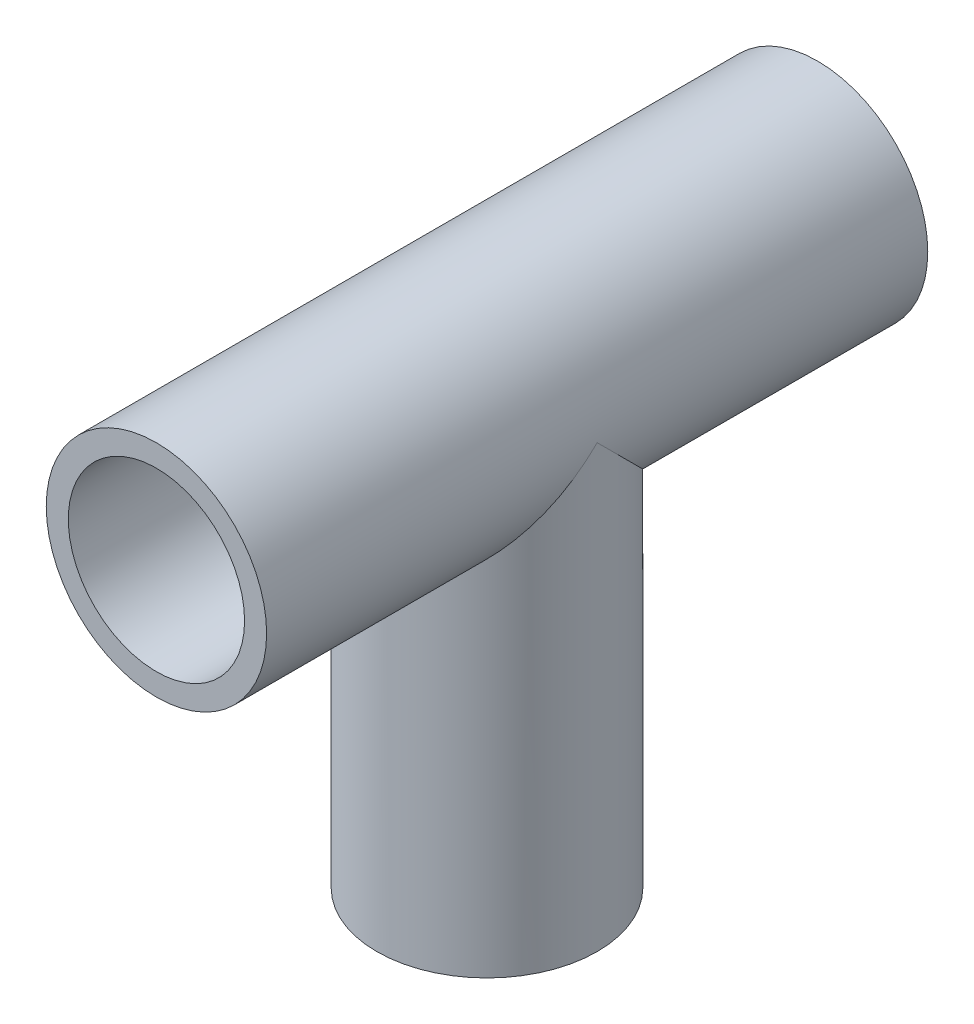
ISO-10303-21;
HEADER;
FILE_DESCRIPTION(('STEP AP214'),'2;1');
FILE_NAME('part.step','',(''),(''),'','','');
FILE_SCHEMA(('AUTOMOTIVE_DESIGN { 1 0 10303 214 1 1 1 1 }'));
ENDSEC;
DATA;
#1=APPLICATION_CONTEXT('core data for automotive mechanical design processes');
#2=APPLICATION_PROTOCOL_DEFINITION('international standard','automotive_design',2000,#1);
#3=PRODUCT_CONTEXT('',#1,'mechanical');
#4=PRODUCT('Part','Part','',(#3));
#5=PRODUCT_RELATED_PRODUCT_CATEGORY('part','',(#4));
#6=PRODUCT_DEFINITION_FORMATION('','',#4);
#7=PRODUCT_DEFINITION_CONTEXT('part definition',#1,'design');
#8=PRODUCT_DEFINITION('design','',#6,#7);
#9=PRODUCT_DEFINITION_SHAPE('','',#8);
#10=(LENGTH_UNIT() NAMED_UNIT(*) SI_UNIT(.MILLI.,.METRE.));
#11=(NAMED_UNIT(*) PLANE_ANGLE_UNIT() SI_UNIT($,.RADIAN.));
#12=(NAMED_UNIT(*) SI_UNIT($,.STERADIAN.) SOLID_ANGLE_UNIT());
#13=UNCERTAINTY_MEASURE_WITH_UNIT(LENGTH_MEASURE(1.E-05),#10,'distance_accuracy_value','');
#14=(GEOMETRIC_REPRESENTATION_CONTEXT(3) GLOBAL_UNCERTAINTY_ASSIGNED_CONTEXT((#13)) GLOBAL_UNIT_ASSIGNED_CONTEXT((#10,
#11,#12)) REPRESENTATION_CONTEXT('',''));
#15=CARTESIAN_POINT('',(0.,0.,0.));
#16=DIRECTION('',(0.,0.,1.));
#17=DIRECTION('',(1.,0.,0.));
#18=AXIS2_PLACEMENT_3D('',#15,#16,#17);
#19=CARTESIAN_POINT('',(0.,0.,0.));
#20=DIRECTION('',(0.,1.,0.));
#21=DIRECTION('',(0.,0.,1.));
#22=AXIS2_PLACEMENT_3D('',#19,#20,#21);
#23=PLANE('',#22);
#24=CARTESIAN_POINT('',(0.,0.,0.));
#25=DIRECTION('',(0.,1.,0.));
#26=DIRECTION('',(0.,0.,1.));
#27=AXIS2_PLACEMENT_3D('',#24,#25,#26);
#28=CIRCLE('',#27,2.5);
#29=CARTESIAN_POINT('',(0.,0.,2.5));
#30=VERTEX_POINT('',#29);
#31=EDGE_CURVE('E11',#30,#30,#28,.T.);
#32=ORIENTED_EDGE('',*,*,#31,.F.);
#33=EDGE_LOOP('',(#32));
#34=FACE_BOUND('',#33,.T.);
#35=CARTESIAN_POINT('',(0.,0.,0.));
#36=DIRECTION('',(0.,1.,0.));
#37=DIRECTION('',(0.,0.,1.));
#38=AXIS2_PLACEMENT_3D('',#35,#36,#37);
#39=CIRCLE('',#38,2.);
#40=CARTESIAN_POINT('',(0.,0.,2.));
#41=VERTEX_POINT('',#40);
#42=EDGE_CURVE('E54',#41,#41,#39,.T.);
#43=ORIENTED_EDGE('',*,*,#42,.T.);
#44=EDGE_LOOP('',(#43));
#45=FACE_BOUND('',#44,.T.);
#46=ADVANCED_FACE('F45',(#34,#45),#23,.F.);
#47=CARTESIAN_POINT('',(0.,10.,0.));
#48=DIRECTION('',(0.,-1.,0.));
#49=DIRECTION('',(0.,0.,-1.));
#50=AXIS2_PLACEMENT_3D('',#47,#48,#49);
#51=CYLINDRICAL_SURFACE('',#50,2.5);
#52=CARTESIAN_POINT('',(0.,10.,0.));
#53=DIRECTION('',(0.,-0.707106781186547,-0.707106781186547));
#54=DIRECTION('',(0.,-0.707106781186547,0.707106781186547));
#55=AXIS2_PLACEMENT_3D('',#52,#53,#54);
#56=ELLIPSE('',#55,3.53553390593274,2.5);
#57=CARTESIAN_POINT('',(2.5,10.,0.));
#58=VERTEX_POINT('',#57);
#59=CARTESIAN_POINT('',(-2.5,10.,0.));
#60=VERTEX_POINT('',#59);
#61=EDGE_CURVE('E98',#58,#60,#56,.T.);
#62=ORIENTED_EDGE('',*,*,#61,.T.);
#63=CARTESIAN_POINT('',(0.,10.,0.));
#64=DIRECTION('',(0.,-0.707106781186547,0.707106781186547));
#65=DIRECTION('',(0.,-0.707106781186547,-0.707106781186547));
#66=AXIS2_PLACEMENT_3D('',#63,#64,#65);
#67=ELLIPSE('',#66,3.53553390593274,2.5);
#68=EDGE_CURVE('E67',#60,#58,#67,.T.);
#69=ORIENTED_EDGE('',*,*,#68,.T.);
#70=EDGE_LOOP('',(#62,#69));
#71=FACE_BOUND('',#70,.T.);
#72=ORIENTED_EDGE('',*,*,#31,.T.);
#73=EDGE_LOOP('',(#72));
#74=FACE_BOUND('',#73,.T.);
#75=ADVANCED_FACE('F47',(#71,#74),#51,.T.);
#76=CARTESIAN_POINT('',(0.,10.,0.));
#77=DIRECTION('',(0.,-1.,0.));
#78=DIRECTION('',(0.,0.,-1.));
#79=AXIS2_PLACEMENT_3D('',#76,#77,#78);
#80=CYLINDRICAL_SURFACE('',#79,2.);
#81=ORIENTED_EDGE('',*,*,#42,.F.);
#82=EDGE_LOOP('',(#81));
#83=FACE_BOUND('',#82,.T.);
#84=CARTESIAN_POINT('',(0.,10.,0.));
#85=DIRECTION('',(0.,-0.707106781186547,0.707106781186547));
#86=DIRECTION('',(0.,-0.707106781186547,-0.707106781186547));
#87=AXIS2_PLACEMENT_3D('',#84,#85,#86);
#88=ELLIPSE('',#87,2.82842712474619,2.);
#89=CARTESIAN_POINT('',(2.,10.,0.));
#90=VERTEX_POINT('',#89);
#91=CARTESIAN_POINT('',(-2.,10.,0.));
#92=VERTEX_POINT('',#91);
#93=EDGE_CURVE('E60',#90,#92,#88,.F.);
#94=ORIENTED_EDGE('',*,*,#93,.T.);
#95=CARTESIAN_POINT('',(0.,10.,0.));
#96=DIRECTION('',(0.,-0.707106781186547,-0.707106781186547));
#97=DIRECTION('',(0.,-0.707106781186547,0.707106781186547));
#98=AXIS2_PLACEMENT_3D('',#95,#96,#97);
#99=ELLIPSE('',#98,2.82842712474619,2.);
#100=EDGE_CURVE('E72',#92,#90,#99,.F.);
#101=ORIENTED_EDGE('',*,*,#100,.T.);
#102=EDGE_LOOP('',(#94,#101));
#103=FACE_BOUND('',#102,.T.);
#104=ADVANCED_FACE('F73',(#83,#103),#80,.F.);
#105=CARTESIAN_POINT('',(0.,10.,-7.5));
#106=DIRECTION('',(0.,0.,1.));
#107=DIRECTION('',(1.,0.,0.));
#108=AXIS2_PLACEMENT_3D('',#105,#106,#107);
#109=CYLINDRICAL_SURFACE('',#108,2.5);
#110=CARTESIAN_POINT('',(0.,10.,7.5));
#111=DIRECTION('',(0.,0.,1.));
#112=DIRECTION('',(1.,0.,0.));
#113=AXIS2_PLACEMENT_3D('',#110,#111,#112);
#114=CIRCLE('',#113,2.5);
#115=CARTESIAN_POINT('',(2.5,10.,7.5));
#116=VERTEX_POINT('',#115);
#117=EDGE_CURVE('E84',#116,#116,#114,.T.);
#118=ORIENTED_EDGE('',*,*,#117,.F.);
#119=EDGE_LOOP('',(#118));
#120=FACE_BOUND('',#119,.T.);
#121=CARTESIAN_POINT('',(0.,10.,-7.5));
#122=DIRECTION('',(0.,0.,1.));
#123=DIRECTION('',(1.,0.,0.));
#124=AXIS2_PLACEMENT_3D('',#121,#122,#123);
#125=CIRCLE('',#124,2.5);
#126=CARTESIAN_POINT('',(2.5,10.,-7.5));
#127=VERTEX_POINT('',#126);
#128=EDGE_CURVE('E94',#127,#127,#125,.T.);
#129=ORIENTED_EDGE('',*,*,#128,.T.);
#130=EDGE_LOOP('',(#129));
#131=FACE_BOUND('',#130,.T.);
#132=ORIENTED_EDGE('',*,*,#68,.F.);
#133=ORIENTED_EDGE('',*,*,#61,.F.);
#134=EDGE_LOOP('',(#132,#133));
#135=FACE_BOUND('',#134,.T.);
#136=ADVANCED_FACE('F108',(#120,#131,#135),#109,.T.);
#137=CARTESIAN_POINT('',(0.,10.,-7.5));
#138=DIRECTION('',(0.,0.,1.));
#139=DIRECTION('',(1.,0.,0.));
#140=AXIS2_PLACEMENT_3D('',#137,#138,#139);
#141=CYLINDRICAL_SURFACE('',#140,2.);
#142=ORIENTED_EDGE('',*,*,#100,.F.);
#143=ORIENTED_EDGE('',*,*,#93,.F.);
#144=EDGE_LOOP('',(#142,#143));
#145=FACE_BOUND('',#144,.T.);
#146=CARTESIAN_POINT('',(0.,10.,-7.5));
#147=DIRECTION('',(0.,0.,1.));
#148=DIRECTION('',(1.,0.,0.));
#149=AXIS2_PLACEMENT_3D('',#146,#147,#148);
#150=CIRCLE('',#149,2.);
#151=CARTESIAN_POINT('',(2.,10.,-7.5));
#152=VERTEX_POINT('',#151);
#153=EDGE_CURVE('E90',#152,#152,#150,.T.);
#154=ORIENTED_EDGE('',*,*,#153,.F.);
#155=EDGE_LOOP('',(#154));
#156=FACE_BOUND('',#155,.T.);
#157=CARTESIAN_POINT('',(0.,10.,7.5));
#158=DIRECTION('',(0.,0.,1.));
#159=DIRECTION('',(1.,0.,0.));
#160=AXIS2_PLACEMENT_3D('',#157,#158,#159);
#161=CIRCLE('',#160,2.);
#162=CARTESIAN_POINT('',(2.,10.,7.5));
#163=VERTEX_POINT('',#162);
#164=EDGE_CURVE('E80',#163,#163,#161,.T.);
#165=ORIENTED_EDGE('',*,*,#164,.T.);
#166=EDGE_LOOP('',(#165));
#167=FACE_BOUND('',#166,.T.);
#168=ADVANCED_FACE('F77',(#145,#156,#167),#141,.F.);
#169=CARTESIAN_POINT('',(0.,10.,-7.5));
#170=DIRECTION('',(0.,0.,1.));
#171=DIRECTION('',(1.,0.,0.));
#172=AXIS2_PLACEMENT_3D('',#169,#170,#171);
#173=PLANE('',#172);
#174=ORIENTED_EDGE('',*,*,#153,.T.);
#175=EDGE_LOOP('',(#174));
#176=FACE_BOUND('',#175,.T.);
#177=ORIENTED_EDGE('',*,*,#128,.F.);
#178=EDGE_LOOP('',(#177));
#179=FACE_BOUND('',#178,.T.);
#180=ADVANCED_FACE('F141',(#176,#179),#173,.F.);
#181=CARTESIAN_POINT('',(0.,10.,7.5));
#182=DIRECTION('',(0.,0.,1.));
#183=DIRECTION('',(1.,0.,0.));
#184=AXIS2_PLACEMENT_3D('',#181,#182,#183);
#185=PLANE('',#184);
#186=ORIENTED_EDGE('',*,*,#117,.T.);
#187=EDGE_LOOP('',(#186));
#188=FACE_BOUND('',#187,.T.);
#189=ORIENTED_EDGE('',*,*,#164,.F.);
#190=EDGE_LOOP('',(#189));
#191=FACE_BOUND('',#190,.T.);
#192=ADVANCED_FACE('F144',(#188,#191),#185,.T.);
#193=CLOSED_SHELL('',(#46,#75,#104,#136,#168,#180,#192));
#194=MANIFOLD_SOLID_BREP('B2',#193);
#195=ADVANCED_BREP_SHAPE_REPRESENTATION('',(#18,#194),#14);
#196=SHAPE_DEFINITION_REPRESENTATION(#9,#195);
ENDSEC;
END-ISO-10303-21;
